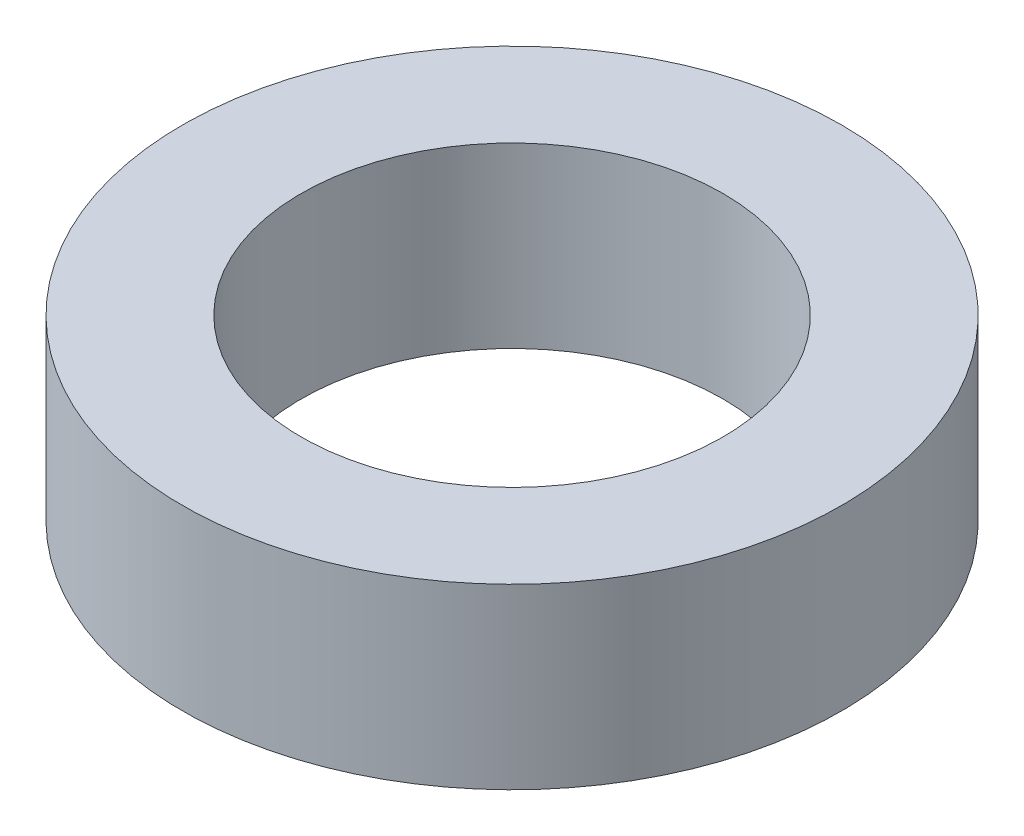
ISO-10303-21;
HEADER;
FILE_DESCRIPTION(('STEP AP214'),'2;1');
FILE_NAME('part.step','',(''),(''),'','','');
FILE_SCHEMA(('AUTOMOTIVE_DESIGN { 1 0 10303 214 1 1 1 1 }'));
ENDSEC;
DATA;
#1=APPLICATION_CONTEXT('core data for automotive mechanical design processes');
#2=APPLICATION_PROTOCOL_DEFINITION('international standard','automotive_design',2000,#1);
#3=PRODUCT_CONTEXT('',#1,'mechanical');
#4=PRODUCT('Part','Part','',(#3));
#5=PRODUCT_RELATED_PRODUCT_CATEGORY('part','',(#4));
#6=PRODUCT_DEFINITION_FORMATION('','',#4);
#7=PRODUCT_DEFINITION_CONTEXT('part definition',#1,'design');
#8=PRODUCT_DEFINITION('design','',#6,#7);
#9=PRODUCT_DEFINITION_SHAPE('','',#8);
#10=(LENGTH_UNIT() NAMED_UNIT(*) SI_UNIT(.MILLI.,.METRE.));
#11=(NAMED_UNIT(*) PLANE_ANGLE_UNIT() SI_UNIT($,.RADIAN.));
#12=(NAMED_UNIT(*) SI_UNIT($,.STERADIAN.) SOLID_ANGLE_UNIT());
#13=UNCERTAINTY_MEASURE_WITH_UNIT(LENGTH_MEASURE(1.E-05),#10,'distance_accuracy_value','');
#14=(GEOMETRIC_REPRESENTATION_CONTEXT(3) GLOBAL_UNCERTAINTY_ASSIGNED_CONTEXT((#13)) GLOBAL_UNIT_ASSIGNED_CONTEXT((#10,
#11,#12)) REPRESENTATION_CONTEXT('',''));
#15=CARTESIAN_POINT('',(0.,0.,0.));
#16=DIRECTION('',(0.,0.,1.));
#17=DIRECTION('',(1.,0.,0.));
#18=AXIS2_PLACEMENT_3D('',#15,#16,#17);
#19=CARTESIAN_POINT('',(0.,1.35,0.));
#20=DIRECTION('',(0.,1.,0.));
#21=DIRECTION('',(0.,0.,1.));
#22=AXIS2_PLACEMENT_3D('',#19,#20,#21);
#23=PLANE('',#22);
#24=CARTESIAN_POINT('',(0.,1.35,0.));
#25=DIRECTION('',(0.,1.,0.));
#26=DIRECTION('',(0.,0.,1.));
#27=AXIS2_PLACEMENT_3D('',#24,#25,#26);
#28=CIRCLE('',#27,2.5);
#29=CARTESIAN_POINT('',(0.,1.35,-2.5));
#30=VERTEX_POINT('',#29);
#31=EDGE_CURVE('E10',#30,#30,#28,.T.);
#32=ORIENTED_EDGE('',*,*,#31,.T.);
#33=EDGE_LOOP('',(#32));
#34=FACE_BOUND('',#33,.T.);
#35=CARTESIAN_POINT('',(0.,1.35,0.));
#36=DIRECTION('',(0.,1.,0.));
#37=DIRECTION('',(0.,0.,1.));
#38=AXIS2_PLACEMENT_3D('',#35,#36,#37);
#39=CIRCLE('',#38,1.6);
#40=CARTESIAN_POINT('',(0.,1.35,-1.6));
#41=VERTEX_POINT('',#40);
#42=EDGE_CURVE('E43',#41,#41,#39,.T.);
#43=ORIENTED_EDGE('',*,*,#42,.F.);
#44=EDGE_LOOP('',(#43));
#45=FACE_BOUND('',#44,.T.);
#46=ADVANCED_FACE('F32',(#34,#45),#23,.T.);
#47=CARTESIAN_POINT('',(0.,0.,0.));
#48=DIRECTION('',(0.,1.,0.));
#49=DIRECTION('',(0.,0.,1.));
#50=AXIS2_PLACEMENT_3D('',#47,#48,#49);
#51=PLANE('',#50);
#52=CARTESIAN_POINT('',(0.,0.,0.));
#53=DIRECTION('',(0.,1.,0.));
#54=DIRECTION('',(0.,0.,1.));
#55=AXIS2_PLACEMENT_3D('',#52,#53,#54);
#56=CIRCLE('',#55,2.5);
#57=CARTESIAN_POINT('',(0.,0.,-2.5));
#58=VERTEX_POINT('',#57);
#59=EDGE_CURVE('E36',#58,#58,#56,.T.);
#60=ORIENTED_EDGE('',*,*,#59,.F.);
#61=EDGE_LOOP('',(#60));
#62=FACE_BOUND('',#61,.T.);
#63=CARTESIAN_POINT('',(0.,0.,0.));
#64=DIRECTION('',(0.,1.,0.));
#65=DIRECTION('',(0.,0.,1.));
#66=AXIS2_PLACEMENT_3D('',#63,#64,#65);
#67=CIRCLE('',#66,1.6);
#68=CARTESIAN_POINT('',(0.,0.,-1.6));
#69=VERTEX_POINT('',#68);
#70=EDGE_CURVE('E45',#69,#69,#67,.T.);
#71=ORIENTED_EDGE('',*,*,#70,.T.);
#72=EDGE_LOOP('',(#71));
#73=FACE_BOUND('',#72,.T.);
#74=ADVANCED_FACE('F55',(#62,#73),#51,.F.);
#75=CARTESIAN_POINT('',(0.,1.35,0.));
#76=DIRECTION('',(0.,-1.,0.));
#77=DIRECTION('',(0.,0.,-1.));
#78=AXIS2_PLACEMENT_3D('',#75,#76,#77);
#79=CYLINDRICAL_SURFACE('',#78,2.5);
#80=CARTESIAN_POINT('',(0.,1.35,-2.5));
#81=CARTESIAN_POINT('',(0.,1.3359375,-2.5));
#82=CARTESIAN_POINT('',(0.,1.321875,-2.5));
#83=CARTESIAN_POINT('',(0.,1.29375,-2.5));
#84=CARTESIAN_POINT('',(0.,1.2796875,-2.5));
#85=CARTESIAN_POINT('',(0.,1.2515625,-2.5));
#86=CARTESIAN_POINT('',(0.,1.2375,-2.5));
#87=CARTESIAN_POINT('',(0.,1.209375,-2.5));
#88=CARTESIAN_POINT('',(0.,1.1953125,-2.5));
#89=CARTESIAN_POINT('',(0.,1.1671875,-2.5));
#90=CARTESIAN_POINT('',(0.,1.153125,-2.5));
#91=CARTESIAN_POINT('',(0.,1.125,-2.5));
#92=CARTESIAN_POINT('',(0.,1.1109375,-2.5));
#93=CARTESIAN_POINT('',(0.,1.0828125,-2.5));
#94=CARTESIAN_POINT('',(0.,1.06875,-2.5));
#95=CARTESIAN_POINT('',(0.,1.040625,-2.5));
#96=CARTESIAN_POINT('',(0.,1.0265625,-2.5));
#97=CARTESIAN_POINT('',(0.,0.9984375,-2.5));
#98=CARTESIAN_POINT('',(0.,0.984375,-2.5));
#99=CARTESIAN_POINT('',(0.,0.95625,-2.5));
#100=CARTESIAN_POINT('',(0.,0.9421875,-2.5));
#101=CARTESIAN_POINT('',(0.,0.9140625,-2.5));
#102=CARTESIAN_POINT('',(0.,0.9,-2.5));
#103=CARTESIAN_POINT('',(0.,0.871875,-2.5));
#104=CARTESIAN_POINT('',(0.,0.8578125,-2.5));
#105=CARTESIAN_POINT('',(0.,0.8296875,-2.5));
#106=CARTESIAN_POINT('',(0.,0.815625,-2.5));
#107=CARTESIAN_POINT('',(0.,0.7875,-2.5));
#108=CARTESIAN_POINT('',(0.,0.7734375,-2.5));
#109=CARTESIAN_POINT('',(0.,0.7453125,-2.5));
#110=CARTESIAN_POINT('',(0.,0.73125,-2.5));
#111=CARTESIAN_POINT('',(0.,0.703125,-2.5));
#112=CARTESIAN_POINT('',(0.,0.6890625,-2.5));
#113=CARTESIAN_POINT('',(0.,0.6609375,-2.5));
#114=CARTESIAN_POINT('',(0.,0.646875,-2.5));
#115=CARTESIAN_POINT('',(0.,0.61875,-2.5));
#116=CARTESIAN_POINT('',(0.,0.6046875,-2.5));
#117=CARTESIAN_POINT('',(0.,0.5765625,-2.5));
#118=CARTESIAN_POINT('',(0.,0.5625,-2.5));
#119=CARTESIAN_POINT('',(0.,0.534375,-2.5));
#120=CARTESIAN_POINT('',(0.,0.5203125,-2.5));
#121=CARTESIAN_POINT('',(0.,0.4921875,-2.5));
#122=CARTESIAN_POINT('',(0.,0.478125,-2.5));
#123=CARTESIAN_POINT('',(0.,0.45,-2.5));
#124=CARTESIAN_POINT('',(0.,0.4359375,-2.5));
#125=CARTESIAN_POINT('',(0.,0.4078125,-2.5));
#126=CARTESIAN_POINT('',(0.,0.39375,-2.5));
#127=CARTESIAN_POINT('',(0.,0.365625,-2.5));
#128=CARTESIAN_POINT('',(0.,0.3515625,-2.5));
#129=CARTESIAN_POINT('',(0.,0.3234375,-2.5));
#130=CARTESIAN_POINT('',(0.,0.309375,-2.5));
#131=CARTESIAN_POINT('',(0.,0.28125,-2.5));
#132=CARTESIAN_POINT('',(0.,0.2671875,-2.5));
#133=CARTESIAN_POINT('',(0.,0.2390625,-2.5));
#134=CARTESIAN_POINT('',(0.,0.225,-2.5));
#135=CARTESIAN_POINT('',(0.,0.196875,-2.5));
#136=CARTESIAN_POINT('',(0.,0.1828125,-2.5));
#137=CARTESIAN_POINT('',(0.,0.1546875,-2.5));
#138=CARTESIAN_POINT('',(0.,0.140625,-2.5));
#139=CARTESIAN_POINT('',(0.,0.1125,-2.5));
#140=CARTESIAN_POINT('',(0.,0.0984374999999998,-2.5));
#141=CARTESIAN_POINT('',(0.,0.0703124999999998,-2.5));
#142=CARTESIAN_POINT('',(0.,0.0562499999999997,-2.5));
#143=CARTESIAN_POINT('',(0.,0.0281249999999997,-2.5));
#144=CARTESIAN_POINT('',(0.,0.0140624999999997,-2.5));
#145=CARTESIAN_POINT('',(0.,0.,-2.5));
#146=B_SPLINE_CURVE_WITH_KNOTS('',3,(#80,#81,#82,#83,#84,#85,#86,#87,#88,#89,#90,#91,#92,#93,
#94,#95,#96,#97,#98,#99,#100,#101,#102,#103,#104,#105,#106,#107,#108,#109,#110,#111,#112,#113,
#114,#115,#116,#117,#118,#119,#120,#121,#122,#123,#124,#125,#126,#127,#128,#129,#130,#131,#132,
#133,#134,#135,#136,#137,#138,#139,#140,#141,#142,#143,#144,#145),.UNSPECIFIED.,.F.,.F.,(4,2,2,
2,2,2,2,2,2,2,2,2,2,2,2,2,2,2,2,2,2,2,2,2,2,2,2,2,2,2,2,2,4),(0.,0.0421874999999999,
0.0843749999999998,0.1265625,0.16875,0.2109375,0.253125,0.2953125,0.3375,0.3796875,0.421875,
0.4640625,0.50625,0.5484375,0.590625,0.6328125,0.675,0.7171875,0.759375,0.8015625,0.84375,
0.8859375,0.928125,0.9703125,1.0125,1.0546875,1.096875,1.1390625,1.18125,1.2234375,1.265625,
1.3078125,1.35),.UNSPECIFIED.);
#147=EDGE_CURVE('BSEAM34',#30,#58,#146,.T.);
#148=ORIENTED_EDGE('',*,*,#31,.F.);
#149=ORIENTED_EDGE('',*,*,#59,.T.);
#150=ORIENTED_EDGE('',*,*,#147,.T.);
#151=ORIENTED_EDGE('',*,*,#147,.F.);
#152=EDGE_LOOP('',(#148,#150,#149,#151));
#153=FACE_BOUND('',#152,.T.);
#154=ADVANCED_FACE('F34',(#153),#79,.T.);
#155=CARTESIAN_POINT('',(0.,1.35,0.));
#156=DIRECTION('',(0.,-1.,0.));
#157=DIRECTION('',(0.,0.,-1.));
#158=AXIS2_PLACEMENT_3D('',#155,#156,#157);
#159=CYLINDRICAL_SURFACE('',#158,1.6);
#160=CARTESIAN_POINT('',(0.,1.35,-1.6));
#161=CARTESIAN_POINT('',(0.,1.3359375,-1.6));
#162=CARTESIAN_POINT('',(0.,1.321875,-1.6));
#163=CARTESIAN_POINT('',(0.,1.29375,-1.6));
#164=CARTESIAN_POINT('',(0.,1.2796875,-1.6));
#165=CARTESIAN_POINT('',(0.,1.2515625,-1.6));
#166=CARTESIAN_POINT('',(0.,1.2375,-1.6));
#167=CARTESIAN_POINT('',(0.,1.209375,-1.6));
#168=CARTESIAN_POINT('',(0.,1.1953125,-1.6));
#169=CARTESIAN_POINT('',(0.,1.1671875,-1.6));
#170=CARTESIAN_POINT('',(0.,1.153125,-1.6));
#171=CARTESIAN_POINT('',(0.,1.125,-1.6));
#172=CARTESIAN_POINT('',(0.,1.1109375,-1.6));
#173=CARTESIAN_POINT('',(0.,1.0828125,-1.6));
#174=CARTESIAN_POINT('',(0.,1.06875,-1.6));
#175=CARTESIAN_POINT('',(0.,1.040625,-1.6));
#176=CARTESIAN_POINT('',(0.,1.0265625,-1.6));
#177=CARTESIAN_POINT('',(0.,0.9984375,-1.6));
#178=CARTESIAN_POINT('',(0.,0.984375,-1.6));
#179=CARTESIAN_POINT('',(0.,0.95625,-1.6));
#180=CARTESIAN_POINT('',(0.,0.9421875,-1.6));
#181=CARTESIAN_POINT('',(0.,0.9140625,-1.6));
#182=CARTESIAN_POINT('',(0.,0.9,-1.6));
#183=CARTESIAN_POINT('',(0.,0.871875,-1.6));
#184=CARTESIAN_POINT('',(0.,0.8578125,-1.6));
#185=CARTESIAN_POINT('',(0.,0.8296875,-1.6));
#186=CARTESIAN_POINT('',(0.,0.815625,-1.6));
#187=CARTESIAN_POINT('',(0.,0.7875,-1.6));
#188=CARTESIAN_POINT('',(0.,0.7734375,-1.6));
#189=CARTESIAN_POINT('',(0.,0.7453125,-1.6));
#190=CARTESIAN_POINT('',(0.,0.73125,-1.6));
#191=CARTESIAN_POINT('',(0.,0.703125,-1.6));
#192=CARTESIAN_POINT('',(0.,0.6890625,-1.6));
#193=CARTESIAN_POINT('',(0.,0.6609375,-1.6));
#194=CARTESIAN_POINT('',(0.,0.646875,-1.6));
#195=CARTESIAN_POINT('',(0.,0.61875,-1.6));
#196=CARTESIAN_POINT('',(0.,0.6046875,-1.6));
#197=CARTESIAN_POINT('',(0.,0.5765625,-1.6));
#198=CARTESIAN_POINT('',(0.,0.5625,-1.6));
#199=CARTESIAN_POINT('',(0.,0.534375,-1.6));
#200=CARTESIAN_POINT('',(0.,0.5203125,-1.6));
#201=CARTESIAN_POINT('',(0.,0.4921875,-1.6));
#202=CARTESIAN_POINT('',(0.,0.478125,-1.6));
#203=CARTESIAN_POINT('',(0.,0.45,-1.6));
#204=CARTESIAN_POINT('',(0.,0.4359375,-1.6));
#205=CARTESIAN_POINT('',(0.,0.4078125,-1.6));
#206=CARTESIAN_POINT('',(0.,0.39375,-1.6));
#207=CARTESIAN_POINT('',(0.,0.365625,-1.6));
#208=CARTESIAN_POINT('',(0.,0.3515625,-1.6));
#209=CARTESIAN_POINT('',(0.,0.3234375,-1.6));
#210=CARTESIAN_POINT('',(0.,0.309375,-1.6));
#211=CARTESIAN_POINT('',(0.,0.28125,-1.6));
#212=CARTESIAN_POINT('',(0.,0.2671875,-1.6));
#213=CARTESIAN_POINT('',(0.,0.2390625,-1.6));
#214=CARTESIAN_POINT('',(0.,0.225,-1.6));
#215=CARTESIAN_POINT('',(0.,0.196875,-1.6));
#216=CARTESIAN_POINT('',(0.,0.1828125,-1.6));
#217=CARTESIAN_POINT('',(0.,0.1546875,-1.6));
#218=CARTESIAN_POINT('',(0.,0.140625,-1.6));
#219=CARTESIAN_POINT('',(0.,0.1125,-1.6));
#220=CARTESIAN_POINT('',(0.,0.0984374999999998,-1.6));
#221=CARTESIAN_POINT('',(0.,0.0703124999999998,-1.6));
#222=CARTESIAN_POINT('',(0.,0.0562499999999997,-1.6));
#223=CARTESIAN_POINT('',(0.,0.0281249999999997,-1.6));
#224=CARTESIAN_POINT('',(0.,0.0140624999999997,-1.6));
#225=CARTESIAN_POINT('',(0.,0.,-1.6));
#226=B_SPLINE_CURVE_WITH_KNOTS('',3,(#160,#161,#162,#163,#164,#165,#166,#167,#168,#169,#170,
#171,#172,#173,#174,#175,#176,#177,#178,#179,#180,#181,#182,#183,#184,#185,#186,#187,#188,#189,
#190,#191,#192,#193,#194,#195,#196,#197,#198,#199,#200,#201,#202,#203,#204,#205,#206,#207,#208,
#209,#210,#211,#212,#213,#214,#215,#216,#217,#218,#219,#220,#221,#222,#223,#224,#225),
.UNSPECIFIED.,.F.,.F.,(4,2,2,2,2,2,2,2,2,2,2,2,2,2,2,2,2,2,2,2,2,2,2,2,2,2,2,2,2,2,2,2,4),(0.,
0.0421874999999999,0.0843749999999998,0.1265625,0.16875,0.2109375,0.253125,0.2953125,0.3375,
0.3796875,0.421875,0.4640625,0.50625,0.5484375,0.590625,0.6328125,0.675,0.7171875,0.759375,
0.8015625,0.84375,0.8859375,0.928125,0.9703125,1.0125,1.0546875,1.096875,1.1390625,1.18125,
1.2234375,1.265625,1.3078125,1.35),.UNSPECIFIED.);
#227=EDGE_CURVE('BSEAM51',#41,#69,#226,.T.);
#228=ORIENTED_EDGE('',*,*,#42,.T.);
#229=ORIENTED_EDGE('',*,*,#70,.F.);
#230=ORIENTED_EDGE('',*,*,#227,.T.);
#231=ORIENTED_EDGE('',*,*,#227,.F.);
#232=EDGE_LOOP('',(#228,#230,#229,#231));
#233=FACE_BOUND('',#232,.T.);
#234=ADVANCED_FACE('F51',(#233),#159,.F.);
#235=CLOSED_SHELL('',(#46,#74,#154,#234));
#236=MANIFOLD_SOLID_BREP('B2',#235);
#237=ADVANCED_BREP_SHAPE_REPRESENTATION('',(#18,#236),#14);
#238=SHAPE_DEFINITION_REPRESENTATION(#9,#237);
ENDSEC;
END-ISO-10303-21;
